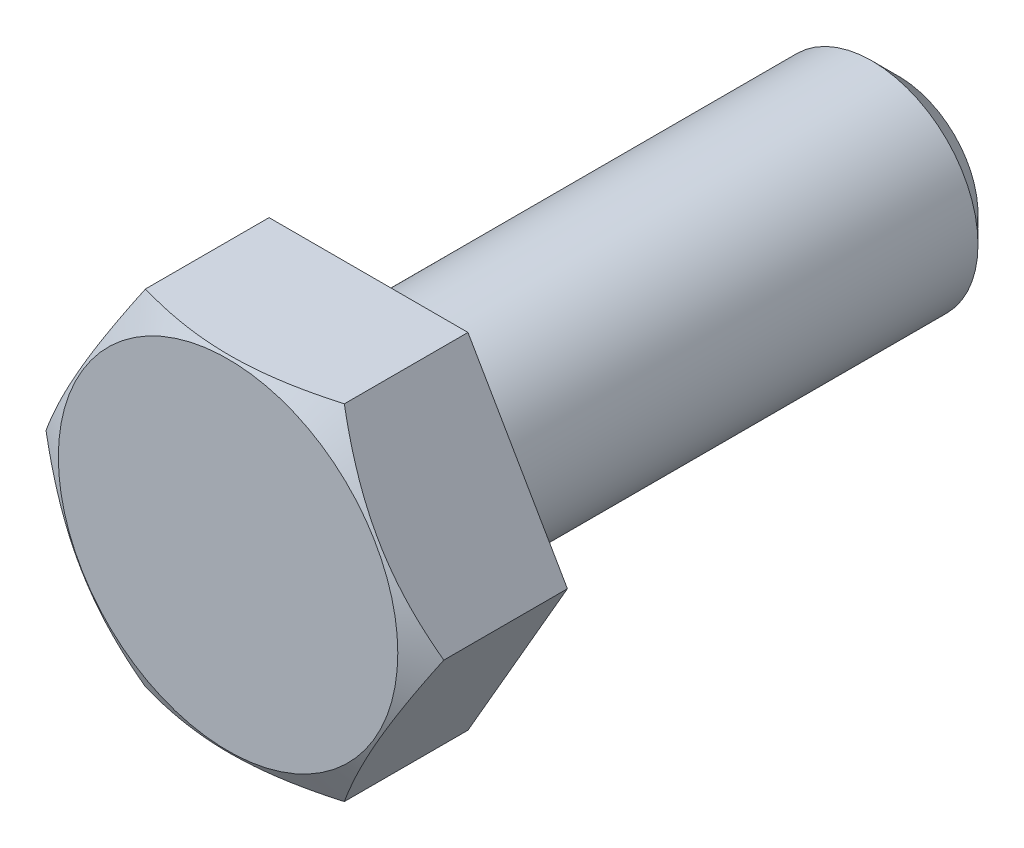
ISO-10303-21;
HEADER;
FILE_DESCRIPTION(('STEP AP214'),'2;1');
FILE_NAME('part.step','',(''),(''),'','','');
FILE_SCHEMA(('AUTOMOTIVE_DESIGN { 1 0 10303 214 1 1 1 1 }'));
ENDSEC;
DATA;
#1=APPLICATION_CONTEXT('core data for automotive mechanical design processes');
#2=APPLICATION_PROTOCOL_DEFINITION('international standard','automotive_design',2000,#1);
#3=PRODUCT_CONTEXT('',#1,'mechanical');
#4=PRODUCT('Part','Part','',(#3));
#5=PRODUCT_RELATED_PRODUCT_CATEGORY('part','',(#4));
#6=PRODUCT_DEFINITION_FORMATION('','',#4);
#7=PRODUCT_DEFINITION_CONTEXT('part definition',#1,'design');
#8=PRODUCT_DEFINITION('design','',#6,#7);
#9=PRODUCT_DEFINITION_SHAPE('','',#8);
#10=(LENGTH_UNIT() NAMED_UNIT(*) SI_UNIT(.MILLI.,.METRE.));
#11=(NAMED_UNIT(*) PLANE_ANGLE_UNIT() SI_UNIT($,.RADIAN.));
#12=(NAMED_UNIT(*) SI_UNIT($,.STERADIAN.) SOLID_ANGLE_UNIT());
#13=UNCERTAINTY_MEASURE_WITH_UNIT(LENGTH_MEASURE(1.E-05),#10,'distance_accuracy_value','');
#14=(GEOMETRIC_REPRESENTATION_CONTEXT(3) GLOBAL_UNCERTAINTY_ASSIGNED_CONTEXT((#13)) GLOBAL_UNIT_ASSIGNED_CONTEXT((#10,
#11,#12)) REPRESENTATION_CONTEXT('',''));
#15=CARTESIAN_POINT('',(0.,0.,0.));
#16=DIRECTION('',(0.,0.,1.));
#17=DIRECTION('',(1.,0.,0.));
#18=AXIS2_PLACEMENT_3D('',#15,#16,#17);
#19=CARTESIAN_POINT('',(3.75277674973273,-6.4999999999989,5.3));
#20=DIRECTION('',(-0.866025403784444,0.499999999999999,0.));
#21=DIRECTION('',(-0.500000000000005,-0.866025403784444,0.));
#22=AXIS2_PLACEMENT_3D('',#19,#20,#21);
#23=PLANE('',#22);
#24=CARTESIAN_POINT('',(3.75266127967944,-6.50019999999868,4.66484803568632));
#25=CARTESIAN_POINT('',(3.83515161912797,-6.35732254093975,4.71246686441693));
#26=CARTESIAN_POINT('',(3.91794952254349,-6.2139123654637,4.75792458688981));
#27=CARTESIAN_POINT('',(4.08421773795823,-5.92592736868142,4.84392260546953));
#28=CARTESIAN_POINT('',(4.16768832359135,-5.78135207342737,4.88446078026452));
#29=CARTESIAN_POINT('',(4.41943655294083,-5.34531134947865,4.99790028636927));
#30=CARTESIAN_POINT('',(4.58870793403717,-5.05212471715239,5.06242348036374));
#31=CARTESIAN_POINT('',(4.84201947708239,-4.61337625445438,5.13808470394497));
#32=CARTESIAN_POINT('',(4.92530276780338,-4.46912536350408,5.15963843103547));
#33=CARTESIAN_POINT('',(5.09224566542499,-4.17997178286071,5.19578097288632));
#34=CARTESIAN_POINT('',(5.1759052384165,-4.03506915189994,5.21037040303276));
#35=CARTESIAN_POINT('',(5.3433696857998,-3.74501222057051,5.23221253498508));
#36=CARTESIAN_POINT('',(5.4271742866761,-3.5998583939446,5.23947356317033));
#37=CARTESIAN_POINT('',(5.59485627940507,-3.30942466302398,5.24651098491015));
#38=CARTESIAN_POINT('',(5.67873366892905,-3.16414476276271,5.24628760968011));
#39=CARTESIAN_POINT('',(5.90853103021379,-2.76612405757268,5.23538782897708));
#40=CARTESIAN_POINT('',(6.05437578112791,-2.51351353897139,5.21708946962293));
#41=CARTESIAN_POINT('',(6.34509659313138,-2.00997032176312,5.15906494603472));
#42=CARTESIAN_POINT('',(6.48997163178557,-1.75903939406577,5.11931894895412));
#43=CARTESIAN_POINT('',(6.78127752911057,-1.25448277935456,5.01996538429017));
#44=CARTESIAN_POINT('',(6.92767163007083,-1.00092075856294,4.95993686185429));
#45=CARTESIAN_POINT('',(7.21827667013294,-0.49757806423981,4.82369629498244));
#46=CARTESIAN_POINT('',(7.36249133098612,-0.247790944445914,4.74751625332871));
#47=CARTESIAN_POINT('',(7.50566896951943,0.000200000001004952,4.66484803568643));
#48=B_SPLINE_CURVE_WITH_KNOTS('',3,(#24,#25,#26,#27,#28,#29,#30,#31,#32,#33,#34,#35,#36,#37,#38,
#39,#40,#41,#42,#43,#44,#45,#46,#47),.UNSPECIFIED.,.F.,.F.,(4,2,2,2,2,2,2,2,2,2,2,4),(0.,
0.515105052395552,1.03043143507517,2.06322554824243,2.56697389547971,3.07067772176423,
3.57380860368892,4.0769239424248,4.95279354705623,5.8294744685343,6.72559912449702,
7.61996451221015),.UNSPECIFIED.);
#49=CARTESIAN_POINT('',(3.75277674973284,-6.49999999999906,4.66491470389141));
#50=VERTEX_POINT('',#49);
#51=CARTESIAN_POINT('',(7.50555349946525,9.99200722162641E-13,4.66491470389152));
#52=VERTEX_POINT('',#51);
#53=EDGE_CURVE('E86',#50,#52,#48,.T.);
#54=ORIENTED_EDGE('',*,*,#53,.F.);
#55=DIRECTION('',(0.,0.,-1.));
#56=VECTOR('',#55,1.);
#57=CARTESIAN_POINT('',(3.75277674973273,-6.4999999999989,5.3));
#58=LINE('',#57,#56);
#59=CARTESIAN_POINT('',(3.75277674973362,-6.4999999999994,0.));
#60=VERTEX_POINT('',#59);
#61=EDGE_CURVE('E55',#50,#60,#58,.T.);
#62=ORIENTED_EDGE('',*,*,#61,.T.);
#63=DIRECTION('',(0.500000000000004,0.866025403784444,0.));
#64=VECTOR('',#63,1.);
#65=CARTESIAN_POINT('',(3.75277674973362,-6.4999999999994,0.));
#66=LINE('',#65,#64);
#67=CARTESIAN_POINT('',(7.50555349946525,9.99200722162641E-13,0.));
#68=VERTEX_POINT('',#67);
#69=EDGE_CURVE('E94',#60,#68,#66,.T.);
#70=ORIENTED_EDGE('',*,*,#69,.T.);
#71=DIRECTION('',(0.,0.,-1.));
#72=VECTOR('',#71,1.);
#73=CARTESIAN_POINT('',(7.50555349946536,7.21644966006352E-13,5.30000000000011));
#74=LINE('',#73,#72);
#75=EDGE_CURVE('E93',#52,#68,#74,.T.);
#76=ORIENTED_EDGE('',*,*,#75,.F.);
#77=EDGE_LOOP('',(#54,#62,#70,#76));
#78=FACE_BOUND('',#77,.T.);
#79=ADVANCED_FACE('F32',(#78),#23,.F.);
#80=CARTESIAN_POINT('',(7.50555349946536,7.21644966006352E-13,5.30000000000011));
#81=DIRECTION('',(-0.866025403784446,-0.500000000000004,0.));
#82=DIRECTION('',(0.500000000000001,-0.86602540378444,0.));
#83=AXIS2_PLACEMENT_3D('',#80,#81,#82);
#84=PLANE('',#83);
#85=CARTESIAN_POINT('',(7.50566896951965,-0.000199999999339617,4.66484803568643));
#86=CARTESIAN_POINT('',(7.42317863007067,0.142677459059443,4.71246686441674));
#87=CARTESIAN_POINT('',(7.34038072665496,0.286087634535434,4.75792458688948));
#88=CARTESIAN_POINT('',(7.17411251124007,0.574072631317686,4.84392260546912));
#89=CARTESIAN_POINT('',(7.09064192560698,0.718647926571766,4.88446078026415));
#90=CARTESIAN_POINT('',(6.83889369625755,1.15468865052056,4.99790028636899));
#91=CARTESIAN_POINT('',(6.66962231516115,1.44787528284684,5.06242348036346));
#92=CARTESIAN_POINT('',(6.41631077211588,1.88662374554491,5.1380847039447));
#93=CARTESIAN_POINT('',(6.33302748139487,2.03087463649523,5.15963843103521));
#94=CARTESIAN_POINT('',(6.16608458377326,2.32002821713863,5.19578097288608));
#95=CARTESIAN_POINT('',(6.08242501078175,2.46493084809943,5.21037040303254));
#96=CARTESIAN_POINT('',(5.91496056339839,2.75498777942887,5.23221253498486));
#97=CARTESIAN_POINT('',(5.83115596252204,2.90014160605478,5.23947356317008));
#98=CARTESIAN_POINT('',(5.66347396979316,3.19057533697549,5.24651098491));
#99=CARTESIAN_POINT('',(5.57959658026934,3.33585523723687,5.24628760968007));
#100=CARTESIAN_POINT('',(5.34979921898471,3.73387594242698,5.23538782897715));
#101=CARTESIAN_POINT('',(5.20395446807035,3.98648646102811,5.21708946962283));
#102=CARTESIAN_POINT('',(4.9132336560667,4.49002967823627,5.15906494603451));
#103=CARTESIAN_POINT('',(4.76835861741258,4.74096060593366,5.11931894895397));
#104=CARTESIAN_POINT('',(4.4770527200876,5.24551722064489,5.01996538429007));
#105=CARTESIAN_POINT('',(4.3306586191273,5.49907924143648,4.95993686185419));
#106=CARTESIAN_POINT('',(4.04005357906525,6.00242193575965,4.82369629498235));
#107=CARTESIAN_POINT('',(3.89583891821219,6.25220905555361,4.74751625332864));
#108=CARTESIAN_POINT('',(3.75266127967921,6.50020000000073,4.66484803568643));
#109=B_SPLINE_CURVE_WITH_KNOTS('',3,(#85,#86,#87,#88,#89,#90,#91,#92,#93,#94,#95,#96,#97,#98,
#99,#100,#101,#102,#103,#104,#105,#106,#107,#108),.UNSPECIFIED.,.F.,.F.,(4,2,2,2,2,2,2,2,2,2,2,
4),(0.,0.515105052395589,1.03043143507525,2.06322554824265,2.56697389548001,3.07067772176459,
3.57380860368934,4.07692394242527,4.95279354705667,5.82947446853475,6.72559912449747,
7.61996451221057),.UNSPECIFIED.);
#110=CARTESIAN_POINT('',(3.75277674973262,6.50000000000139,4.66491470389155));
#111=VERTEX_POINT('',#110);
#112=EDGE_CURVE('E95',#52,#111,#109,.T.);
#113=ORIENTED_EDGE('',*,*,#112,.F.);
#114=ORIENTED_EDGE('',*,*,#75,.T.);
#115=DIRECTION('',(-0.500000000000001,0.86602540378444,0.));
#116=VECTOR('',#115,1.);
#117=CARTESIAN_POINT('',(7.50555349946525,9.99200722162641E-13,0.));
#118=LINE('',#117,#116);
#119=CARTESIAN_POINT('',(3.75277674973329,6.50000000000128,1.12757025938492E-13));
#120=VERTEX_POINT('',#119);
#121=EDGE_CURVE('E287',#68,#120,#118,.T.);
#122=ORIENTED_EDGE('',*,*,#121,.T.);
#123=DIRECTION('',(0.,0.,-1.));
#124=VECTOR('',#123,1.);
#125=CARTESIAN_POINT('',(3.75277674973262,6.50000000000139,5.30000000000011));
#126=LINE('',#125,#124);
#127=EDGE_CURVE('E112',#111,#120,#126,.T.);
#128=ORIENTED_EDGE('',*,*,#127,.F.);
#129=EDGE_LOOP('',(#113,#114,#122,#128));
#130=FACE_BOUND('',#129,.T.);
#131=ADVANCED_FACE('F135',(#130),#84,.F.);
#132=CARTESIAN_POINT('',(3.75277674973262,6.50000000000139,5.30000000000011));
#133=DIRECTION('',(0.,-1.,0.));
#134=DIRECTION('',(1.,0.,0.));
#135=AXIS2_PLACEMENT_3D('',#132,#133,#134);
#136=PLANE('',#135);
#137=CARTESIAN_POINT('',(-10.102278731421,6.50000000000123,2.06268664280432));
#138=CARTESIAN_POINT('',(-9.81815375878311,6.50000000000136,2.20060048114339));
#139=CARTESIAN_POINT('',(-9.53337880684501,6.50000000000141,2.33719808376064));
#140=CARTESIAN_POINT('',(-8.96218329492694,6.50000000000145,2.60702082908997));
#141=CARTESIAN_POINT('',(-8.67576248599134,6.50000000000144,2.74024544419231));
#142=CARTESIAN_POINT('',(-8.09946487138899,6.50000000000143,3.00324755807156));
#143=CARTESIAN_POINT('',(-7.80957775400485,6.50000000000143,3.13300253913198));
#144=CARTESIAN_POINT('',(-7.22750496622855,6.50000000000143,3.38723025359005));
#145=CARTESIAN_POINT('',(-6.93531940467137,6.50000000000142,3.5117032353352));
#146=CARTESIAN_POINT('',(-6.33875976342485,6.50000000000143,3.75786204845303));
#147=CARTESIAN_POINT('',(-6.03429541474745,6.50000000000144,3.879330299318));
#148=CARTESIAN_POINT('',(-5.421812758075,6.5000000000014,4.11312634995552));
#149=CARTESIAN_POINT('',(-5.11379405696947,6.50000000000134,4.22545312740299));
#150=CARTESIAN_POINT('',(-4.49428287950421,6.5000000000015,4.43803446131494));
#151=CARTESIAN_POINT('',(-4.18279879854235,6.50000000000172,4.53831324402326));
#152=CARTESIAN_POINT('',(-3.55535973105216,6.50000000000111,4.72359454809002));
#153=CARTESIAN_POINT('',(-3.23940617891375,6.50000000000028,4.80860185570261));
#154=CARTESIAN_POINT('',(-2.60457572898218,6.50000000000029,4.95883754256499));
#155=CARTESIAN_POINT('',(-2.28572414672463,6.50000000000112,5.02417118817022));
#156=CARTESIAN_POINT('',(-1.64398870927788,6.5000000000017,5.13135039274461));
#157=CARTESIAN_POINT('',(-1.32110525951977,6.50000000000145,5.1731982942254));
#158=CARTESIAN_POINT('',(-0.837189552127275,6.50000000000139,5.21557815323528));
#159=CARTESIAN_POINT('',(-0.677009963701441,6.50000000000141,5.2263009007614));
#160=CARTESIAN_POINT('',(-0.356333746134931,6.50000000000139,5.24096769624243));
#161=CARTESIAN_POINT('',(-0.195837122333773,6.50000000000134,5.2449118574042));
#162=CARTESIAN_POINT('',(0.125178614742582,6.50000000000147,5.24591985327795));
#163=CARTESIAN_POINT('',(0.285697728234458,6.50000000000164,5.24298361638125));
#164=CARTESIAN_POINT('',(0.606469408297903,6.50000000000117,5.23030476014288));
#165=CARTESIAN_POINT('',(0.766721961314602,6.50000000000052,5.22056180467602));
#166=CARTESIAN_POINT('',(1.15111799772192,6.50000000000022,5.18923379332248));
#167=CARTESIAN_POINT('',(1.37500710024203,6.50000000000108,5.1644601859851));
#168=CARTESIAN_POINT('',(1.82112815737712,6.50000000000172,5.1029721122913));
#169=CARTESIAN_POINT('',(2.04335988591083,6.50000000000151,5.06625604628179));
#170=CARTESIAN_POINT('',(2.70730582859257,6.50000000000117,4.94014070704354));
#171=CARTESIAN_POINT('',(3.14603159530389,6.50000000000135,4.83479637159796));
#172=CARTESIAN_POINT('',(3.80222805913238,6.50000000000142,4.65202121551488));
#173=CARTESIAN_POINT('',(4.02309723477703,6.50000000000141,4.58608976470595));
#174=CARTESIAN_POINT('',(4.46268971068683,6.50000000000138,4.44736032296545));
#175=CARTESIAN_POINT('',(4.68141299547569,6.50000000000135,4.3745622825518));
#176=CARTESIAN_POINT('',(5.11678425213427,6.50000000000143,4.22326953737892));
#177=CARTESIAN_POINT('',(5.3334328606669,6.50000000000153,4.14477664805517));
#178=CARTESIAN_POINT('',(5.7649315679997,6.50000000000125,3.98301986688194));
#179=CARTESIAN_POINT('',(5.97978169941259,6.50000000000088,3.89975606176169));
#180=CARTESIAN_POINT('',(6.53154168480752,6.50000000000063,3.68000511627538));
#181=CARTESIAN_POINT('',(6.86727047704281,6.50000000000119,3.54055618388047));
#182=CARTESIAN_POINT('',(7.5355203385844,6.50000000000159,3.25414861580668));
#183=CARTESIAN_POINT('',(7.86804112196991,6.50000000000144,3.10718931796802));
#184=CARTESIAN_POINT('',(8.53056306908176,6.50000000000133,2.80744404935542));
#185=CARTESIAN_POINT('',(8.86056341378517,6.50000000000137,2.65465627384492));
#186=CARTESIAN_POINT('',(9.51841914180881,6.5000000000014,2.34457085957399));
#187=CARTESIAN_POINT('',(9.84627459297456,6.50000000000139,2.1872733643167));
#188=CARTESIAN_POINT('',(10.5006941990538,6.50000000000138,1.86888389350713));
#189=CARTESIAN_POINT('',(10.8272559472973,6.50000000000138,1.70778698065012));
#190=CARTESIAN_POINT('',(11.4789412887235,6.50000000000138,1.38270990853532));
#191=CARTESIAN_POINT('',(11.8040648726015,6.50000000000138,1.21872973065753));
#192=CARTESIAN_POINT('',(12.777543343987,6.50000000000138,0.723364798990407));
#193=CARTESIAN_POINT('',(13.4241252725136,6.50000000000138,0.388497064292125));
#194=CARTESIAN_POINT('',(14.6511611237838,6.50000000000138,-0.254633335671607));
#195=CARTESIAN_POINT('',(15.2319229934917,6.50000000000139,-0.562311200753183));
#196=CARTESIAN_POINT('',(16.3914441792979,6.50000000000137,-1.18148444284025));
#197=CARTESIAN_POINT('',(16.9702033940472,6.50000000000135,-1.49298000952841));
#198=CARTESIAN_POINT('',(18.124464573988,6.5000000000014,-2.11789704064724));
#199=CARTESIAN_POINT('',(18.6999711098165,6.50000000000148,-2.43131007600377));
#200=CARTESIAN_POINT('',(19.849727560579,6.50000000000127,-3.0603416937359));
#201=CARTESIAN_POINT('',(20.4239775577934,6.50000000000098,-3.37596012565549));
#202=CARTESIAN_POINT('',(20.9977785238168,6.50000000000028,-3.69238765653562));
#203=B_SPLINE_CURVE_WITH_KNOTS('',3,(#137,#138,#139,#140,#141,#142,#143,#144,#145,#146,#147,
#148,#149,#150,#151,#152,#153,#154,#155,#156,#157,#158,#159,#160,#161,#162,#163,#164,#165,#166,
#167,#168,#169,#170,#171,#172,#173,#174,#175,#176,#177,#178,#179,#180,#181,#182,#183,#184,#185,
#186,#187,#188,#189,#190,#191,#192,#193,#194,#195,#196,#197,#198,#199,#200,#201,#202),
.UNSPECIFIED.,.F.,.F.,(4,2,2,2,2,2,2,2,2,2,2,2,2,2,2,2,2,2,2,2,2,2,2,2,2,2,2,2,2,2,2,2,4),(0.,
0.947495014489615,1.89513733373278,2.8479005012222,3.80061882222383,4.78390656264031,
5.76730411711425,6.74868992027233,7.72976760730503,8.70549862257654,9.68113229932433,
10.1626249304442,10.6441095202408,11.1255991211759,11.6071125004149,12.282498334771,
12.9579746721203,14.3096447748438,15.001085917952,15.6925320441111,16.3837587076367,
17.0749728095161,18.1654545255138,19.2560325514813,20.3469510508157,21.4378348746317,
22.530224273713,23.6226207299891,25.8070149051582,27.7786873152061,29.7504580882513,
31.7163928292068,33.6821947352344),.UNSPECIFIED.);
#204=CARTESIAN_POINT('',(-3.7527767497324,6.50000000000117,4.66491470389155));
#205=VERTEX_POINT('',#204);
#206=EDGE_CURVE('E183',#111,#205,#203,.F.);
#207=ORIENTED_EDGE('',*,*,#206,.F.);
#208=ORIENTED_EDGE('',*,*,#127,.T.);
#209=DIRECTION('',(-1.,0.,0.));
#210=VECTOR('',#209,1.);
#211=CARTESIAN_POINT('',(3.75277674973329,6.50000000000128,1.12757025938492E-13));
#212=LINE('',#211,#210);
#213=CARTESIAN_POINT('',(-3.75277674973218,6.50000000000095,1.40512601554121E-13));
#214=VERTEX_POINT('',#213);
#215=EDGE_CURVE('E288',#120,#214,#212,.T.);
#216=ORIENTED_EDGE('',*,*,#215,.T.);
#217=DIRECTION('',(0.,0.,-1.));
#218=VECTOR('',#217,1.);
#219=CARTESIAN_POINT('',(-3.7527767497324,6.50000000000117,5.30000000000014));
#220=LINE('',#219,#218);
#221=EDGE_CURVE('E110',#205,#214,#220,.T.);
#222=ORIENTED_EDGE('',*,*,#221,.F.);
#223=EDGE_LOOP('',(#207,#208,#216,#222));
#224=FACE_BOUND('',#223,.T.);
#225=ADVANCED_FACE('F139',(#224),#136,.F.);
#226=CARTESIAN_POINT('',(-3.7527767497324,6.50000000000117,5.30000000000014));
#227=DIRECTION('',(0.866025403784442,-0.5,0.));
#228=DIRECTION('',(0.500000000000005,0.866025403784444,0.));
#229=AXIS2_PLACEMENT_3D('',#226,#227,#228);
#230=PLANE('',#229);
#231=CARTESIAN_POINT('',(-3.75266127967833,6.50020000000112,4.66484803568645));
#232=CARTESIAN_POINT('',(-3.83515161912727,6.35732254094225,4.71246686441656));
#233=CARTESIAN_POINT('',(-3.91794952254295,6.21391236546622,4.75792458688922));
#234=CARTESIAN_POINT('',(-4.08421773795783,5.92592736868393,4.84392260546879));
#235=CARTESIAN_POINT('',(-4.16768832359092,5.78135207342986,4.88446078026385));
#236=CARTESIAN_POINT('',(-4.41943655294038,5.34531134948105,4.99790028636872));
#237=CARTESIAN_POINT('',(-4.58870793403679,5.05212471715474,5.06242348036318));
#238=CARTESIAN_POINT('',(-4.84201947708207,4.61337625445664,5.13808470394443));
#239=CARTESIAN_POINT('',(-4.92530276780308,4.46912536350631,5.15963843103493));
#240=CARTESIAN_POINT('',(-5.09224566542471,4.1799717828629,5.19578097288582));
#241=CARTESIAN_POINT('',(-5.17590523841623,4.03506915190209,5.21037040303229));
#242=CARTESIAN_POINT('',(-5.34336968579957,3.74501222057262,5.23221253498457));
#243=CARTESIAN_POINT('',(-5.42717428667588,3.5998583939467,5.23947356316976));
#244=CARTESIAN_POINT('',(-5.59485627940487,3.30942466302603,5.24651098490978));
#245=CARTESIAN_POINT('',(-5.67873366892883,3.16414476276473,5.24628760968002));
#246=CARTESIAN_POINT('',(-5.90853103021354,2.7661240575747,5.23538782897723));
#247=CARTESIAN_POINT('',(-6.05437578112768,2.51351353897348,5.21708946962266));
#248=CARTESIAN_POINT('',(-6.34509659313114,2.00997032176527,5.15906494603418));
#249=CARTESIAN_POINT('',(-6.4899716317853,1.75903939406792,5.11931894895371));
#250=CARTESIAN_POINT('',(-6.78127752911032,1.25448277935675,5.01996538428989));
#251=CARTESIAN_POINT('',(-6.92767163007063,1.00092075856518,4.95993686185399));
#252=CARTESIAN_POINT('',(-7.21827667013257,0.49757806424199,4.82369629498218));
#253=CARTESIAN_POINT('',(-7.36249133098553,0.247790944447991,4.7475162533285));
#254=CARTESIAN_POINT('',(-7.50566896951832,-0.000199999999228595,4.6648480356864));
#255=B_SPLINE_CURVE_WITH_KNOTS('',3,(#231,#232,#233,#234,#235,#236,#237,#238,#239,#240,#241,
#242,#243,#244,#245,#246,#247,#248,#249,#250,#251,#252,#253,#254),.UNSPECIFIED.,.F.,.F.,(4,2,2,
2,2,2,2,2,2,2,2,4),(0.,0.515105052395593,1.03043143507526,2.06322554824275,2.56697389548013,
3.07067772176474,3.5738086036895,4.07692394242543,4.95279354705677,5.82947446853479,
6.72559912449746,7.61996451221047),.UNSPECIFIED.);
#256=CARTESIAN_POINT('',(-7.50555349946513,7.21644966006352E-13,4.66491470389149));
#257=VERTEX_POINT('',#256);
#258=EDGE_CURVE('E177',#205,#257,#255,.T.);
#259=ORIENTED_EDGE('',*,*,#258,.F.);
#260=ORIENTED_EDGE('',*,*,#221,.T.);
#261=DIRECTION('',(-0.500000000000005,-0.866025403784444,0.));
#262=VECTOR('',#261,1.);
#263=CARTESIAN_POINT('',(-3.75277674973218,6.50000000000095,1.40512601554121E-13));
#264=LINE('',#263,#262);
#265=CARTESIAN_POINT('',(-7.50555349946425,1.0547118733939E-12,0.));
#266=VERTEX_POINT('',#265);
#267=EDGE_CURVE('E291',#214,#266,#264,.T.);
#268=ORIENTED_EDGE('',*,*,#267,.T.);
#269=DIRECTION('',(0.,0.,-1.));
#270=VECTOR('',#269,1.);
#271=CARTESIAN_POINT('',(-7.50555349946513,7.21644966006352E-13,5.30000000000008));
#272=LINE('',#271,#270);
#273=EDGE_CURVE('E103',#257,#266,#272,.T.);
#274=ORIENTED_EDGE('',*,*,#273,.F.);
#275=EDGE_LOOP('',(#259,#260,#268,#274));
#276=FACE_BOUND('',#275,.T.);
#277=ADVANCED_FACE('F190',(#276),#230,.F.);
#278=CARTESIAN_POINT('',(-7.50555349946513,7.21644966006352E-13,5.30000000000008));
#279=DIRECTION('',(0.866025403784446,0.500000000000004,0.));
#280=DIRECTION('',(-0.500000000000001,0.86602540378444,0.));
#281=AXIS2_PLACEMENT_3D('',#278,#279,#280);
#282=PLANE('',#281);
#283=CARTESIAN_POINT('',(-7.50566896951843,0.000200000001115974,4.6648480356864));
#284=CARTESIAN_POINT('',(-7.42317863007001,-0.142677459058,4.7124668644166));
#285=CARTESIAN_POINT('',(-7.34038072665454,-0.286087634534123,4.7579245868893));
#286=CARTESIAN_POINT('',(-7.17411251123984,-0.574072631316455,4.8439226054689));
#287=CARTESIAN_POINT('',(-7.09064192560671,-0.718647926570484,4.88446078026394));
#288=CARTESIAN_POINT('',(-6.83889369625721,-1.15468865051918,4.99790028636878));
#289=CARTESIAN_POINT('',(-6.66962231516086,-1.44787528284547,5.06242348036324));
#290=CARTESIAN_POINT('',(-6.41631077211564,-1.88662374554351,5.13808470394449));
#291=CARTESIAN_POINT('',(-6.33302748139464,-2.03087463649382,5.159638431035));
#292=CARTESIAN_POINT('',(-6.16608458377302,-2.32002821713719,5.19578097288588));
#293=CARTESIAN_POINT('',(-6.08242501078151,-2.46493084809797,5.21037040303235));
#294=CARTESIAN_POINT('',(-5.91496056339821,-2.7549877794274,5.23221253498465));
#295=CARTESIAN_POINT('',(-5.83115596252191,-2.90014160605332,5.23947356316986));
#296=CARTESIAN_POINT('',(-5.66347396979292,-3.19057533697393,5.24651098490985));
#297=CARTESIAN_POINT('',(-5.57959658026893,-3.33585523723519,5.24628760968));
#298=CARTESIAN_POINT('',(-5.34979921898417,-3.73387594242522,5.23538782897717));
#299=CARTESIAN_POINT('',(-5.20395446807007,-3.98648646102653,5.21708946962274));
#300=CARTESIAN_POINT('',(-4.91323365606661,-4.49002967823483,5.15906494603435));
#301=CARTESIAN_POINT('',(-4.76835861741239,-4.7409606059322,5.11931894895384));
#302=CARTESIAN_POINT('',(-4.47705272008735,-5.24551722064346,5.01996538428999));
#303=CARTESIAN_POINT('',(-4.33065861912708,-5.49907924143509,4.9599368618541));
#304=CARTESIAN_POINT('',(-4.04005357906496,-6.00242193575828,4.82369629498226));
#305=CARTESIAN_POINT('',(-3.8958389182118,-6.2522090555522,4.74751625332853));
#306=CARTESIAN_POINT('',(-3.75266127967855,-6.50019999999918,4.66484803568631));
#307=B_SPLINE_CURVE_WITH_KNOTS('',3,(#283,#284,#285,#286,#287,#288,#289,#290,#291,#292,#293,
#294,#295,#296,#297,#298,#299,#300,#301,#302,#303,#304,#305,#306),.UNSPECIFIED.,.F.,.F.,(4,2,2,
2,2,2,2,2,2,2,2,4),(0.,0.515105052395532,1.03043143507514,2.06322554824246,2.56697389547977,
3.07067772176431,3.57380860368901,4.07692394242488,4.95279354705635,5.82947446853449,
6.72559912449729,7.61996451221045),.UNSPECIFIED.);
#308=CARTESIAN_POINT('',(-3.75277674973284,-6.49999999999906,4.66491470389141));
#309=VERTEX_POINT('',#308);
#310=EDGE_CURVE('E47',#257,#309,#307,.T.);
#311=ORIENTED_EDGE('',*,*,#310,.F.);
#312=ORIENTED_EDGE('',*,*,#273,.T.);
#313=DIRECTION('',(0.5,-0.86602540378444,0.));
#314=VECTOR('',#313,1.);
#315=CARTESIAN_POINT('',(-7.50555349946425,1.0547118733939E-12,0.));
#316=LINE('',#315,#314);
#317=CARTESIAN_POINT('',(-3.75277674973251,-6.49999999999962,0.));
#318=VERTEX_POINT('',#317);
#319=EDGE_CURVE('E105',#266,#318,#316,.T.);
#320=ORIENTED_EDGE('',*,*,#319,.T.);
#321=DIRECTION('',(0.,0.,-1.));
#322=VECTOR('',#321,1.);
#323=CARTESIAN_POINT('',(-3.75277674973307,-6.49999999999917,5.3));
#324=LINE('',#323,#322);
#325=EDGE_CURVE('E101',#309,#318,#324,.T.);
#326=ORIENTED_EDGE('',*,*,#325,.F.);
#327=EDGE_LOOP('',(#311,#312,#320,#326));
#328=FACE_BOUND('',#327,.T.);
#329=ADVANCED_FACE('F194',(#328),#282,.F.);
#330=CARTESIAN_POINT('',(-3.75277674973307,-6.49999999999917,5.3));
#331=DIRECTION('',(0.,1.,0.));
#332=DIRECTION('',(-1.,0.,0.));
#333=AXIS2_PLACEMENT_3D('',#330,#331,#332);
#334=PLANE('',#333);
#335=CARTESIAN_POINT('',(-10.1022787318222,-6.49999999999873,2.0626866426092));
#336=CARTESIAN_POINT('',(-9.818153759171,-6.499999999999,2.20060048095677));
#337=CARTESIAN_POINT('',(-9.53337880721945,-6.49999999999911,2.33719808358231));
#338=CARTESIAN_POINT('',(-8.96218329527437,-6.49999999999919,2.60702082892803));
#339=CARTESIAN_POINT('',(-8.6757624863252,-6.49999999999916,2.74024544403844));
#340=CARTESIAN_POINT('',(-8.09946487169556,-6.49999999999915,3.0032475579339));
#341=CARTESIAN_POINT('',(-7.80957775429769,-6.49999999999915,3.13300253900244));
#342=CARTESIAN_POINT('',(-7.22750496649383,-6.49999999999916,3.3872302534766));
#343=CARTESIAN_POINT('',(-6.93531940492281,-6.49999999999916,3.51170323522973));
#344=CARTESIAN_POINT('',(-6.33875976364763,-6.49999999999916,3.75786204836372));
#345=CARTESIAN_POINT('',(-6.03429541495538,-6.49999999999917,3.87933029923685));
#346=CARTESIAN_POINT('',(-5.42181275825299,-6.49999999999916,4.11312634989022));
#347=CARTESIAN_POINT('',(-5.11379405713238,-6.49999999999916,4.22545312734538));
#348=CARTESIAN_POINT('',(-4.49428287963668,-6.49999999999918,4.43803446127211));
#349=CARTESIAN_POINT('',(-4.18279879865946,-6.4999999999992,4.53831324398751));
#350=CARTESIAN_POINT('',(-3.555359731138,-6.49999999999914,4.72359454806681));
#351=CARTESIAN_POINT('',(-3.23940617898367,-6.49999999999906,4.80860185568484));
#352=CARTESIAN_POINT('',(-2.60457572901217,-6.49999999999906,4.958837542559));
#353=CARTESIAN_POINT('',(-2.2857241467305,-6.49999999999915,5.02417118817009));
#354=CARTESIAN_POINT('',(-1.64398870923484,-6.49999999999921,5.13135039275201));
#355=CARTESIAN_POINT('',(-1.32110525945194,-6.49999999999919,5.17319829423446));
#356=CARTESIAN_POINT('',(-0.837189552022451,-6.49999999999918,5.21557815324373));
#357=CARTESIAN_POINT('',(-0.677009963584463,-6.49999999999918,5.22630090076913));
#358=CARTESIAN_POINT('',(-0.356333745993681,-6.49999999999919,5.2409676962476));
#359=CARTESIAN_POINT('',(-0.195837122180404,-6.4999999999992,5.24491185740754));
#360=CARTESIAN_POINT('',(0.12517861492012,-6.49999999999917,5.24591985327674));
#361=CARTESIAN_POINT('',(0.285697728424045,-6.49999999999913,5.24298361637733));
#362=CARTESIAN_POINT('',(0.606469408511399,-6.49999999999923,5.23030476013195));
#363=CARTESIAN_POINT('',(0.766721961539957,-6.49999999999937,5.22056180466078));
#364=CARTESIAN_POINT('',(1.15111799796591,-6.49999999999943,5.18923379329763));
#365=CARTESIAN_POINT('',(1.37500710049278,-6.49999999999925,5.16446018595548));
#366=CARTESIAN_POINT('',(1.82112815764098,-6.49999999999912,5.10297211225103));
#367=CARTESIAN_POINT('',(2.04335988618106,-6.49999999999917,5.06625604623563));
#368=CARTESIAN_POINT('',(2.70730582888156,-6.49999999999923,4.94014070697982));
#369=CARTESIAN_POINT('',(3.14603159560493,-6.49999999999919,4.83479637152267));
#370=CARTESIAN_POINT('',(3.80222805945143,-6.49999999999919,4.65202121542235));
#371=CARTESIAN_POINT('',(4.0230972351022,-6.4999999999992,4.5860897646076));
#372=CARTESIAN_POINT('',(4.46268971102417,-6.49999999999919,4.44736032285564));
#373=CARTESIAN_POINT('',(4.68141299581908,-6.49999999999916,4.37456228243634));
#374=CARTESIAN_POINT('',(5.11678425248975,-6.49999999999923,4.22326953725238));
#375=CARTESIAN_POINT('',(5.33343286102841,-6.49999999999931,4.14477664792319));
#376=CARTESIAN_POINT('',(5.76493156837324,-6.49999999999908,3.9830198667392));
#377=CARTESIAN_POINT('',(5.97978169979214,-6.49999999999875,3.89975606161365));
#378=CARTESIAN_POINT('',(6.5315416851908,-6.49999999999855,3.68000511611865));
#379=CARTESIAN_POINT('',(6.86727047742396,-6.49999999999902,3.54055618372085));
#380=CARTESIAN_POINT('',(7.53552033896153,-6.49999999999937,3.25414861564205));
#381=CARTESIAN_POINT('',(7.86804112234515,-6.49999999999925,3.10718931780124));
#382=CARTESIAN_POINT('',(8.53056306945343,-6.49999999999915,2.80744404918496));
#383=CARTESIAN_POINT('',(8.86056341415515,-6.49999999999919,2.65465627367293));
#384=CARTESIAN_POINT('',(9.51841914217559,-6.49999999999921,2.34457085939934));
#385=CARTESIAN_POINT('',(9.84627459333983,-6.4999999999992,2.18727336414095));
#386=CARTESIAN_POINT('',(10.5006941994161,-6.4999999999992,1.86888389332951));
#387=CARTESIAN_POINT('',(10.8272559476581,-6.4999999999992,1.70778698047175));
#388=CARTESIAN_POINT('',(11.4789412890815,-6.49999999999921,1.38270990835569));
#389=CARTESIAN_POINT('',(11.8040648729582,-6.4999999999992,1.2187297304774));
#390=CARTESIAN_POINT('',(12.7775433443398,-6.4999999999992,0.723364798809007));
#391=CARTESIAN_POINT('',(13.4241252728639,-6.49999999999921,0.388497064110247));
#392=CARTESIAN_POINT('',(14.6511611241317,-6.49999999999921,-0.254633335854992));
#393=CARTESIAN_POINT('',(15.2319229938394,-6.49999999999921,-0.562311200937654));
#394=CARTESIAN_POINT('',(16.3914441796455,-6.49999999999921,-1.18148444302666));
#395=CARTESIAN_POINT('',(16.9702033943948,-6.49999999999921,-1.49298000971569));
#396=CARTESIAN_POINT('',(18.1244645743361,-6.49999999999921,-2.11789704083626));
#397=CARTESIAN_POINT('',(18.6999711101651,-6.49999999999922,-2.43131007619367));
#398=CARTESIAN_POINT('',(19.8497275609285,-6.49999999999921,-3.06034169392749));
#399=CARTESIAN_POINT('',(20.4239775581433,-6.4999999999992,-3.37596012584788));
#400=CARTESIAN_POINT('',(20.9977785241672,-6.49999999999917,-3.69238765672883));
#401=B_SPLINE_CURVE_WITH_KNOTS('',3,(#335,#336,#337,#338,#339,#340,#341,#342,#343,#344,#345,
#346,#347,#348,#349,#350,#351,#352,#353,#354,#355,#356,#357,#358,#359,#360,#361,#362,#363,#364,
#365,#366,#367,#368,#369,#370,#371,#372,#373,#374,#375,#376,#377,#378,#379,#380,#381,#382,#383,
#384,#385,#386,#387,#388,#389,#390,#391,#392,#393,#394,#395,#396,#397,#398,#399,#400),
.UNSPECIFIED.,.F.,.F.,(4,2,2,2,2,2,2,2,2,2,2,2,2,2,2,2,2,2,2,2,2,2,2,2,2,2,2,2,2,2,2,2,4),(0.,
0.947495014536756,1.89513733382705,2.84790050136402,3.8006188224132,4.78390656288011,
5.76730411740448,6.74868992061287,7.7297676076959,8.70549862304169,9.68113229986358,
10.1626249310196,10.6441095208525,11.1255991218238,11.6071125010991,12.2824983354769,
12.9579746728479,14.3096447756147,15.0010859187455,15.6925320449272,16.3837587084754,
17.0749728103774,18.1654545263725,19.2560325523374,20.3469510516692,21.4378348754826,
22.5302242745609,23.6226207308341,25.8070149059973,27.7786873160465,29.750458089093,
31.7163928300509,33.6821947360809),.UNSPECIFIED.);
#402=EDGE_CURVE('E84',#309,#50,#401,.T.);
#403=ORIENTED_EDGE('',*,*,#402,.F.);
#404=ORIENTED_EDGE('',*,*,#325,.T.);
#405=DIRECTION('',(1.,0.,0.));
#406=VECTOR('',#405,1.);
#407=CARTESIAN_POINT('',(-3.75277674973251,-6.49999999999962,0.));
#408=LINE('',#407,#406);
#409=EDGE_CURVE('E99',#318,#60,#408,.T.);
#410=ORIENTED_EDGE('',*,*,#409,.T.);
#411=ORIENTED_EDGE('',*,*,#61,.F.);
#412=EDGE_LOOP('',(#403,#404,#410,#411));
#413=FACE_BOUND('',#412,.T.);
#414=ADVANCED_FACE('F97',(#413),#334,.F.);
#415=CARTESIAN_POINT('',(0.,0.,0.));
#416=DIRECTION('',(0.,0.,1.));
#417=DIRECTION('',(1.,0.,0.));
#418=AXIS2_PLACEMENT_3D('',#415,#416,#417);
#419=PLANE('',#418);
#420=ORIENTED_EDGE('',*,*,#69,.F.);
#421=ORIENTED_EDGE('',*,*,#409,.F.);
#422=ORIENTED_EDGE('',*,*,#319,.F.);
#423=ORIENTED_EDGE('',*,*,#267,.F.);
#424=ORIENTED_EDGE('',*,*,#215,.F.);
#425=ORIENTED_EDGE('',*,*,#121,.F.);
#426=EDGE_LOOP('',(#420,#421,#422,#423,#424,#425));
#427=FACE_BOUND('',#426,.T.);
#428=CARTESIAN_POINT('',(0.,0.,0.));
#429=DIRECTION('',(0.,0.,1.));
#430=DIRECTION('',(1.,0.,0.));
#431=AXIS2_PLACEMENT_3D('',#428,#429,#430);
#432=CIRCLE('',#431,4.);
#433=CARTESIAN_POINT('',(4.00000000000002,0.,0.));
#434=VERTEX_POINT('',#433);
#435=EDGE_CURVE('E115',#434,#434,#432,.F.);
#436=ORIENTED_EDGE('',*,*,#435,.F.);
#437=EDGE_LOOP('',(#436));
#438=FACE_BOUND('',#437,.T.);
#439=ADVANCED_FACE('F202',(#427,#438),#419,.F.);
#440=CARTESIAN_POINT('',(2.22044604925031E-13,-1.66533453693773E-13,-20.));
#441=DIRECTION('',(0.,0.,1.));
#442=DIRECTION('',(1.,0.,0.));
#443=AXIS2_PLACEMENT_3D('',#440,#441,#442);
#444=CYLINDRICAL_SURFACE('',#443,4.);
#445=CARTESIAN_POINT('',(2.22044604925031E-13,-1.66533453693773E-13,-19.));
#446=DIRECTION('',(0.,0.,-1.));
#447=DIRECTION('',(-1.,0.,0.));
#448=AXIS2_PLACEMENT_3D('',#445,#446,#447);
#449=CIRCLE('',#448,4.);
#450=CARTESIAN_POINT('',(-3.9999999999998,-1.77524661637563E-13,-19.));
#451=VERTEX_POINT('',#450);
#452=EDGE_CURVE('E11',#451,#451,#449,.F.);
#453=ORIENTED_EDGE('',*,*,#452,.T.);
#454=EDGE_LOOP('',(#453));
#455=FACE_BOUND('',#454,.T.);
#456=ORIENTED_EDGE('',*,*,#435,.T.);
#457=EDGE_LOOP('',(#456));
#458=FACE_BOUND('',#457,.T.);
#459=ADVANCED_FACE('F131',(#455,#458),#444,.T.);
#460=CARTESIAN_POINT('',(2.22044604925031E-13,-1.66533453693773E-13,-20.));
#461=DIRECTION('',(0.,0.,-1.));
#462=DIRECTION('',(-1.,0.,0.));
#463=AXIS2_PLACEMENT_3D('',#460,#461,#462);
#464=PLANE('',#463);
#465=CARTESIAN_POINT('',(2.22044604925031E-13,-1.66533453693773E-13,-20.));
#466=DIRECTION('',(0.,0.,-1.));
#467=DIRECTION('',(-1.,0.,0.));
#468=AXIS2_PLACEMENT_3D('',#465,#466,#467);
#469=CIRCLE('',#468,3.);
#470=CARTESIAN_POINT('',(-2.99999999999979,-1.74776859651615E-13,-20.));
#471=VERTEX_POINT('',#470);
#472=EDGE_CURVE('E40',#471,#471,#469,.T.);
#473=ORIENTED_EDGE('',*,*,#472,.T.);
#474=EDGE_LOOP('',(#473));
#475=FACE_BOUND('',#474,.T.);
#476=ADVANCED_FACE('F120',(#475),#464,.T.);
#477=CARTESIAN_POINT('',(2.22044604925031E-13,-1.66533453693773E-13,-20.));
#478=DIRECTION('',(0.,0.,1.));
#479=DIRECTION('',(1.,0.,0.));
#480=AXIS2_PLACEMENT_3D('',#477,#478,#479);
#481=CONICAL_SURFACE('',#480,3.,0.785398163397447);
#482=ORIENTED_EDGE('',*,*,#452,.F.);
#483=EDGE_LOOP('',(#482));
#484=FACE_BOUND('',#483,.T.);
#485=ORIENTED_EDGE('',*,*,#472,.F.);
#486=EDGE_LOOP('',(#485));
#487=FACE_BOUND('',#486,.T.);
#488=ADVANCED_FACE('F34',(#484,#487),#481,.T.);
#489=CARTESIAN_POINT('',(3.33066907387547E-13,6.66133814775094E-13,5.3));
#490=DIRECTION('',(0.,0.,-1.));
#491=DIRECTION('',(-1.,0.,0.));
#492=AXIS2_PLACEMENT_3D('',#489,#490,#491);
#493=CONICAL_SURFACE('',#492,6.40555349946513,1.0471975511966);
#494=CARTESIAN_POINT('',(3.33066907387547E-13,6.66133814775094E-13,5.3));
#495=DIRECTION('',(0.,0.,1.));
#496=DIRECTION('',(1.,0.,0.));
#497=AXIS2_PLACEMENT_3D('',#494,#495,#496);
#498=CIRCLE('',#497,6.40555349946513);
#499=CARTESIAN_POINT('',(6.4055534994655,6.83735007402016E-13,5.3));
#500=VERTEX_POINT('',#499);
#501=EDGE_CURVE('E90',#500,#500,#498,.T.);
#502=ORIENTED_EDGE('',*,*,#501,.F.);
#503=EDGE_LOOP('',(#502));
#504=FACE_BOUND('',#503,.T.);
#505=ORIENTED_EDGE('',*,*,#53,.T.);
#506=ORIENTED_EDGE('',*,*,#112,.T.);
#507=ORIENTED_EDGE('',*,*,#206,.T.);
#508=ORIENTED_EDGE('',*,*,#258,.T.);
#509=ORIENTED_EDGE('',*,*,#310,.T.);
#510=ORIENTED_EDGE('',*,*,#402,.T.);
#511=EDGE_LOOP('',(#505,#506,#507,#508,#509,#510));
#512=FACE_BOUND('',#511,.T.);
#513=ADVANCED_FACE('F85',(#504,#512),#493,.T.);
#514=CARTESIAN_POINT('',(3.33066907387547E-13,6.66133814775094E-13,5.3));
#515=DIRECTION('',(0.,0.,1.));
#516=DIRECTION('',(1.,0.,0.));
#517=AXIS2_PLACEMENT_3D('',#514,#515,#516);
#518=PLANE('',#517);
#519=ORIENTED_EDGE('',*,*,#501,.T.);
#520=EDGE_LOOP('',(#519));
#521=FACE_BOUND('',#520,.T.);
#522=ADVANCED_FACE('F128',(#521),#518,.T.);
#523=CLOSED_SHELL('',(#79,#131,#225,#277,#329,#414,#439,#459,#476,#488,#513,#522));
#524=MANIFOLD_SOLID_BREP('B2',#523);
#525=ADVANCED_BREP_SHAPE_REPRESENTATION('',(#18,#524),#14);
#526=SHAPE_DEFINITION_REPRESENTATION(#9,#525);
ENDSEC;
END-ISO-10303-21;
